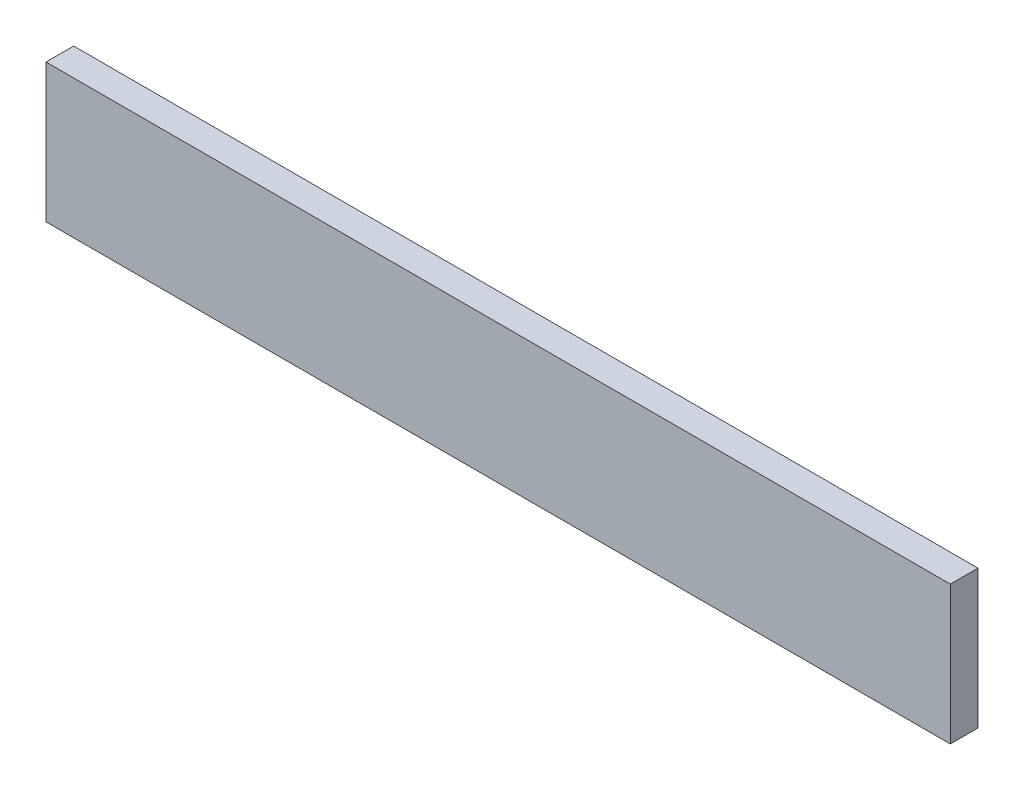
ISO-10303-21;
HEADER;
FILE_DESCRIPTION(('STEP AP214'),'2;1');
FILE_NAME('part.step','',(''),(''),'','','');
FILE_SCHEMA(('AUTOMOTIVE_DESIGN { 1 0 10303 214 1 1 1 1 }'));
ENDSEC;
DATA;
#1=APPLICATION_CONTEXT('core data for automotive mechanical design processes');
#2=APPLICATION_PROTOCOL_DEFINITION('international standard','automotive_design',2000,#1);
#3=PRODUCT_CONTEXT('',#1,'mechanical');
#4=PRODUCT('Part','Part','',(#3));
#5=PRODUCT_RELATED_PRODUCT_CATEGORY('part','',(#4));
#6=PRODUCT_DEFINITION_FORMATION('','',#4);
#7=PRODUCT_DEFINITION_CONTEXT('part definition',#1,'design');
#8=PRODUCT_DEFINITION('design','',#6,#7);
#9=PRODUCT_DEFINITION_SHAPE('','',#8);
#10=(LENGTH_UNIT() NAMED_UNIT(*) SI_UNIT(.MILLI.,.METRE.));
#11=(NAMED_UNIT(*) PLANE_ANGLE_UNIT() SI_UNIT($,.RADIAN.));
#12=(NAMED_UNIT(*) SI_UNIT($,.STERADIAN.) SOLID_ANGLE_UNIT());
#13=UNCERTAINTY_MEASURE_WITH_UNIT(LENGTH_MEASURE(1.E-05),#10,'distance_accuracy_value','');
#14=(GEOMETRIC_REPRESENTATION_CONTEXT(3) GLOBAL_UNCERTAINTY_ASSIGNED_CONTEXT((#13)) GLOBAL_UNIT_ASSIGNED_CONTEXT((#10,
#11,#12)) REPRESENTATION_CONTEXT('',''));
#15=CARTESIAN_POINT('',(0.,0.,0.));
#16=DIRECTION('',(0.,0.,1.));
#17=DIRECTION('',(1.,0.,0.));
#18=AXIS2_PLACEMENT_3D('',#15,#16,#17);
#19=CARTESIAN_POINT('',(0.,0.,15.));
#20=DIRECTION('',(1.,0.,0.));
#21=DIRECTION('',(0.,0.,-1.));
#22=AXIS2_PLACEMENT_3D('',#19,#20,#21);
#23=PLANE('',#22);
#24=DIRECTION('',(0.,-1.,0.));
#25=VECTOR('',#24,1.);
#26=CARTESIAN_POINT('',(0.,0.,0.));
#27=LINE('',#26,#25);
#28=CARTESIAN_POINT('',(0.,75.,0.));
#29=VERTEX_POINT('',#28);
#30=CARTESIAN_POINT('',(0.,0.,0.));
#31=VERTEX_POINT('',#30);
#32=EDGE_CURVE('E109',#29,#31,#27,.T.);
#33=ORIENTED_EDGE('',*,*,#32,.T.);
#34=DIRECTION('',(0.,0.,-1.));
#35=VECTOR('',#34,1.);
#36=CARTESIAN_POINT('',(0.,0.,15.));
#37=LINE('',#36,#35);
#38=CARTESIAN_POINT('',(0.,0.,15.));
#39=VERTEX_POINT('',#38);
#40=EDGE_CURVE('E11',#39,#31,#37,.T.);
#41=ORIENTED_EDGE('',*,*,#40,.F.);
#42=DIRECTION('',(0.,-1.,0.));
#43=VECTOR('',#42,1.);
#44=CARTESIAN_POINT('',(0.,0.,15.));
#45=LINE('',#44,#43);
#46=CARTESIAN_POINT('',(0.,75.,15.));
#47=VERTEX_POINT('',#46);
#48=EDGE_CURVE('E97',#47,#39,#45,.T.);
#49=ORIENTED_EDGE('',*,*,#48,.F.);
#50=DIRECTION('',(0.,0.,-1.));
#51=VECTOR('',#50,1.);
#52=CARTESIAN_POINT('',(0.,75.,15.));
#53=LINE('',#52,#51);
#54=EDGE_CURVE('E108',#47,#29,#53,.T.);
#55=ORIENTED_EDGE('',*,*,#54,.T.);
#56=EDGE_LOOP('',(#33,#41,#49,#55));
#57=FACE_BOUND('',#56,.T.);
#58=ADVANCED_FACE('F50',(#57),#23,.F.);
#59=CARTESIAN_POINT('',(0.,0.,15.));
#60=DIRECTION('',(0.,1.,0.));
#61=DIRECTION('',(0.,0.,1.));
#62=AXIS2_PLACEMENT_3D('',#59,#60,#61);
#63=PLANE('',#62);
#64=DIRECTION('',(1.,0.,0.));
#65=VECTOR('',#64,1.);
#66=CARTESIAN_POINT('',(0.,0.,0.));
#67=LINE('',#66,#65);
#68=CARTESIAN_POINT('',(490.,0.,0.));
#69=VERTEX_POINT('',#68);
#70=EDGE_CURVE('E105',#31,#69,#67,.T.);
#71=ORIENTED_EDGE('',*,*,#70,.T.);
#72=DIRECTION('',(0.,0.,-1.));
#73=VECTOR('',#72,1.);
#74=CARTESIAN_POINT('',(490.,0.,15.));
#75=LINE('',#74,#73);
#76=CARTESIAN_POINT('',(490.,0.,15.));
#77=VERTEX_POINT('',#76);
#78=EDGE_CURVE('E54',#77,#69,#75,.T.);
#79=ORIENTED_EDGE('',*,*,#78,.F.);
#80=DIRECTION('',(1.,0.,0.));
#81=VECTOR('',#80,1.);
#82=CARTESIAN_POINT('',(0.,0.,15.));
#83=LINE('',#82,#81);
#84=EDGE_CURVE('E93',#39,#77,#83,.T.);
#85=ORIENTED_EDGE('',*,*,#84,.F.);
#86=ORIENTED_EDGE('',*,*,#40,.T.);
#87=EDGE_LOOP('',(#71,#79,#85,#86));
#88=FACE_BOUND('',#87,.T.);
#89=ADVANCED_FACE('F102',(#88),#63,.F.);
#90=CARTESIAN_POINT('',(490.,0.,15.));
#91=DIRECTION('',(-1.,0.,0.));
#92=DIRECTION('',(0.,0.,1.));
#93=AXIS2_PLACEMENT_3D('',#90,#91,#92);
#94=PLANE('',#93);
#95=DIRECTION('',(0.,1.,0.));
#96=VECTOR('',#95,1.);
#97=CARTESIAN_POINT('',(490.,0.,0.));
#98=LINE('',#97,#96);
#99=CARTESIAN_POINT('',(490.,75.,0.));
#100=VERTEX_POINT('',#99);
#101=EDGE_CURVE('E79',#69,#100,#98,.T.);
#102=ORIENTED_EDGE('',*,*,#101,.T.);
#103=DIRECTION('',(0.,0.,-1.));
#104=VECTOR('',#103,1.);
#105=CARTESIAN_POINT('',(490.,75.,15.));
#106=LINE('',#105,#104);
#107=CARTESIAN_POINT('',(490.,75.,15.));
#108=VERTEX_POINT('',#107);
#109=EDGE_CURVE('E104',#108,#100,#106,.T.);
#110=ORIENTED_EDGE('',*,*,#109,.F.);
#111=DIRECTION('',(0.,1.,0.));
#112=VECTOR('',#111,1.);
#113=CARTESIAN_POINT('',(490.,0.,15.));
#114=LINE('',#113,#112);
#115=EDGE_CURVE('E96',#77,#108,#114,.T.);
#116=ORIENTED_EDGE('',*,*,#115,.F.);
#117=ORIENTED_EDGE('',*,*,#78,.T.);
#118=EDGE_LOOP('',(#102,#110,#116,#117));
#119=FACE_BOUND('',#118,.T.);
#120=ADVANCED_FACE('F101',(#119),#94,.F.);
#121=CARTESIAN_POINT('',(0.,75.,15.));
#122=DIRECTION('',(0.,-1.,0.));
#123=DIRECTION('',(0.,0.,-1.));
#124=AXIS2_PLACEMENT_3D('',#121,#122,#123);
#125=PLANE('',#124);
#126=DIRECTION('',(-1.,0.,0.));
#127=VECTOR('',#126,1.);
#128=CARTESIAN_POINT('',(0.,75.,0.));
#129=LINE('',#128,#127);
#130=EDGE_CURVE('E86',#100,#29,#129,.T.);
#131=ORIENTED_EDGE('',*,*,#130,.T.);
#132=ORIENTED_EDGE('',*,*,#54,.F.);
#133=DIRECTION('',(-1.,0.,0.));
#134=VECTOR('',#133,1.);
#135=CARTESIAN_POINT('',(0.,75.,15.));
#136=LINE('',#135,#134);
#137=EDGE_CURVE('E61',#108,#47,#136,.T.);
#138=ORIENTED_EDGE('',*,*,#137,.F.);
#139=ORIENTED_EDGE('',*,*,#109,.T.);
#140=EDGE_LOOP('',(#131,#132,#138,#139));
#141=FACE_BOUND('',#140,.T.);
#142=ADVANCED_FACE('F120',(#141),#125,.F.);
#143=CARTESIAN_POINT('',(0.,0.,15.));
#144=DIRECTION('',(0.,0.,-1.));
#145=DIRECTION('',(-1.,0.,0.));
#146=AXIS2_PLACEMENT_3D('',#143,#144,#145);
#147=PLANE('',#146);
#148=ORIENTED_EDGE('',*,*,#48,.T.);
#149=ORIENTED_EDGE('',*,*,#84,.T.);
#150=ORIENTED_EDGE('',*,*,#115,.T.);
#151=ORIENTED_EDGE('',*,*,#137,.T.);
#152=EDGE_LOOP('',(#148,#149,#150,#151));
#153=FACE_BOUND('',#152,.T.);
#154=ADVANCED_FACE('F92',(#153),#147,.F.);
#155=CARTESIAN_POINT('',(0.,0.,0.));
#156=DIRECTION('',(0.,0.,-1.));
#157=DIRECTION('',(-1.,0.,0.));
#158=AXIS2_PLACEMENT_3D('',#155,#156,#157);
#159=PLANE('',#158);
#160=ORIENTED_EDGE('',*,*,#32,.F.);
#161=ORIENTED_EDGE('',*,*,#130,.F.);
#162=ORIENTED_EDGE('',*,*,#101,.F.);
#163=ORIENTED_EDGE('',*,*,#70,.F.);
#164=EDGE_LOOP('',(#160,#161,#162,#163));
#165=FACE_BOUND('',#164,.T.);
#166=ADVANCED_FACE('F119',(#165),#159,.T.);
#167=CLOSED_SHELL('',(#58,#89,#120,#142,#154,#166));
#168=MANIFOLD_SOLID_BREP('B2',#167);
#169=ADVANCED_BREP_SHAPE_REPRESENTATION('',(#18,#168),#14);
#170=SHAPE_DEFINITION_REPRESENTATION(#9,#169);
ENDSEC;
END-ISO-10303-21;
